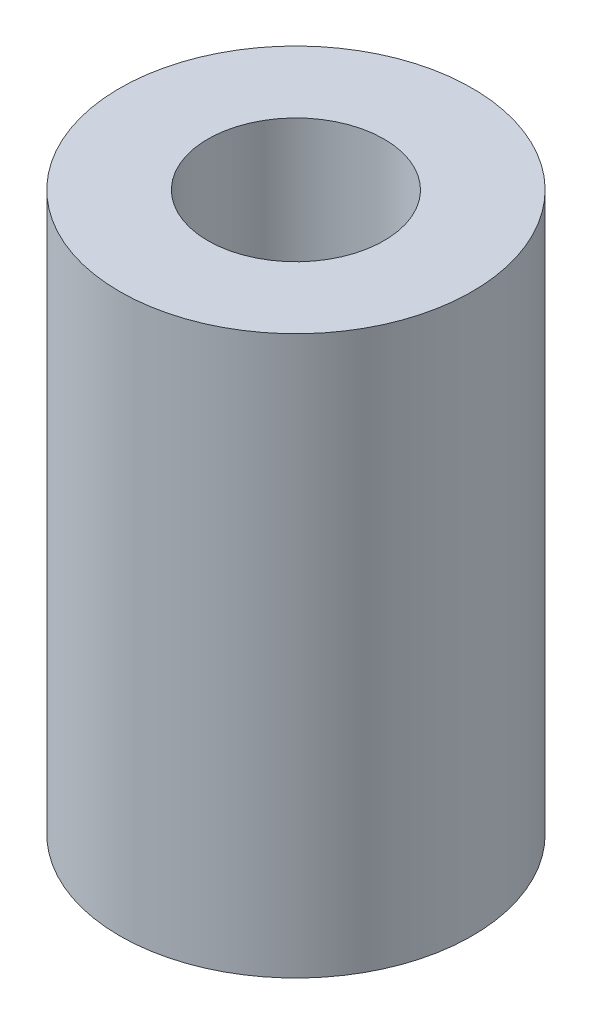
ISO-10303-21;
HEADER;
FILE_DESCRIPTION(('STEP AP214'),'2;1');
FILE_NAME('part.step','',(''),(''),'','','');
FILE_SCHEMA(('AUTOMOTIVE_DESIGN { 1 0 10303 214 1 1 1 1 }'));
ENDSEC;
DATA;
#1=APPLICATION_CONTEXT('core data for automotive mechanical design processes');
#2=APPLICATION_PROTOCOL_DEFINITION('international standard','automotive_design',2000,#1);
#3=PRODUCT_CONTEXT('',#1,'mechanical');
#4=PRODUCT('Part','Part','',(#3));
#5=PRODUCT_RELATED_PRODUCT_CATEGORY('part','',(#4));
#6=PRODUCT_DEFINITION_FORMATION('','',#4);
#7=PRODUCT_DEFINITION_CONTEXT('part definition',#1,'design');
#8=PRODUCT_DEFINITION('design','',#6,#7);
#9=PRODUCT_DEFINITION_SHAPE('','',#8);
#10=(LENGTH_UNIT() NAMED_UNIT(*) SI_UNIT(.MILLI.,.METRE.));
#11=(NAMED_UNIT(*) PLANE_ANGLE_UNIT() SI_UNIT($,.RADIAN.));
#12=(NAMED_UNIT(*) SI_UNIT($,.STERADIAN.) SOLID_ANGLE_UNIT());
#13=UNCERTAINTY_MEASURE_WITH_UNIT(LENGTH_MEASURE(1.E-05),#10,'distance_accuracy_value','');
#14=(GEOMETRIC_REPRESENTATION_CONTEXT(3) GLOBAL_UNCERTAINTY_ASSIGNED_CONTEXT((#13)) GLOBAL_UNIT_ASSIGNED_CONTEXT((#10,
#11,#12)) REPRESENTATION_CONTEXT('',''));
#15=CARTESIAN_POINT('',(0.,0.,0.));
#16=DIRECTION('',(0.,0.,1.));
#17=DIRECTION('',(1.,0.,0.));
#18=AXIS2_PLACEMENT_3D('',#15,#16,#17);
#19=CARTESIAN_POINT('',(0.,19.,0.));
#20=DIRECTION('',(0.,1.,0.));
#21=DIRECTION('',(0.,0.,1.));
#22=AXIS2_PLACEMENT_3D('',#19,#20,#21);
#23=PLANE('',#22);
#24=CARTESIAN_POINT('',(0.,19.,0.));
#25=DIRECTION('',(0.,1.,0.));
#26=DIRECTION('',(0.,0.,1.));
#27=AXIS2_PLACEMENT_3D('',#24,#25,#26);
#28=CIRCLE('',#27,6.);
#29=CARTESIAN_POINT('',(0.,19.,6.));
#30=VERTEX_POINT('',#29);
#31=EDGE_CURVE('E11',#30,#30,#28,.T.);
#32=ORIENTED_EDGE('',*,*,#31,.T.);
#33=EDGE_LOOP('',(#32));
#34=FACE_BOUND('',#33,.T.);
#35=CARTESIAN_POINT('',(0.,19.,0.));
#36=DIRECTION('',(0.,1.,0.));
#37=DIRECTION('',(0.,0.,1.));
#38=AXIS2_PLACEMENT_3D('',#35,#36,#37);
#39=CIRCLE('',#38,3.);
#40=CARTESIAN_POINT('',(0.,19.,3.));
#41=VERTEX_POINT('',#40);
#42=EDGE_CURVE('E62',#41,#41,#39,.T.);
#43=ORIENTED_EDGE('',*,*,#42,.F.);
#44=EDGE_LOOP('',(#43));
#45=FACE_BOUND('',#44,.T.);
#46=ADVANCED_FACE('F49',(#34,#45),#23,.T.);
#47=CARTESIAN_POINT('',(0.,0.,0.));
#48=DIRECTION('',(0.,1.,0.));
#49=DIRECTION('',(0.,0.,1.));
#50=AXIS2_PLACEMENT_3D('',#47,#48,#49);
#51=PLANE('',#50);
#52=CARTESIAN_POINT('',(0.,0.,0.));
#53=DIRECTION('',(0.,1.,0.));
#54=DIRECTION('',(0.,0.,1.));
#55=AXIS2_PLACEMENT_3D('',#52,#53,#54);
#56=CIRCLE('',#55,6.);
#57=CARTESIAN_POINT('',(0.,0.,6.));
#58=VERTEX_POINT('',#57);
#59=EDGE_CURVE('E53',#58,#58,#56,.T.);
#60=ORIENTED_EDGE('',*,*,#59,.F.);
#61=EDGE_LOOP('',(#60));
#62=FACE_BOUND('',#61,.T.);
#63=CARTESIAN_POINT('',(0.,0.,0.));
#64=DIRECTION('',(0.,1.,0.));
#65=DIRECTION('',(0.,0.,1.));
#66=AXIS2_PLACEMENT_3D('',#63,#64,#65);
#67=CIRCLE('',#66,3.);
#68=CARTESIAN_POINT('',(0.,0.,3.));
#69=VERTEX_POINT('',#68);
#70=EDGE_CURVE('E64',#69,#69,#67,.T.);
#71=ORIENTED_EDGE('',*,*,#70,.T.);
#72=EDGE_LOOP('',(#71));
#73=FACE_BOUND('',#72,.T.);
#74=ADVANCED_FACE('F76',(#62,#73),#51,.F.);
#75=CARTESIAN_POINT('',(0.,19.,0.));
#76=DIRECTION('',(0.,-1.,0.));
#77=DIRECTION('',(0.,0.,-1.));
#78=AXIS2_PLACEMENT_3D('',#75,#76,#77);
#79=CYLINDRICAL_SURFACE('',#78,6.);
#80=ORIENTED_EDGE('',*,*,#31,.F.);
#81=EDGE_LOOP('',(#80));
#82=FACE_BOUND('',#81,.T.);
#83=ORIENTED_EDGE('',*,*,#59,.T.);
#84=EDGE_LOOP('',(#83));
#85=FACE_BOUND('',#84,.T.);
#86=ADVANCED_FACE('F51',(#82,#85),#79,.T.);
#87=CARTESIAN_POINT('',(0.,19.,0.));
#88=DIRECTION('',(0.,-1.,0.));
#89=DIRECTION('',(0.,0.,-1.));
#90=AXIS2_PLACEMENT_3D('',#87,#88,#89);
#91=CYLINDRICAL_SURFACE('',#90,3.);
#92=ORIENTED_EDGE('',*,*,#42,.T.);
#93=EDGE_LOOP('',(#92));
#94=FACE_BOUND('',#93,.T.);
#95=ORIENTED_EDGE('',*,*,#70,.F.);
#96=EDGE_LOOP('',(#95));
#97=FACE_BOUND('',#96,.T.);
#98=ADVANCED_FACE('F72',(#94,#97),#91,.F.);
#99=CLOSED_SHELL('',(#46,#74,#86,#98));
#100=MANIFOLD_SOLID_BREP('B2',#99);
#101=ADVANCED_BREP_SHAPE_REPRESENTATION('',(#18,#100),#14);
#102=SHAPE_DEFINITION_REPRESENTATION(#9,#101);
ENDSEC;
END-ISO-10303-21;
